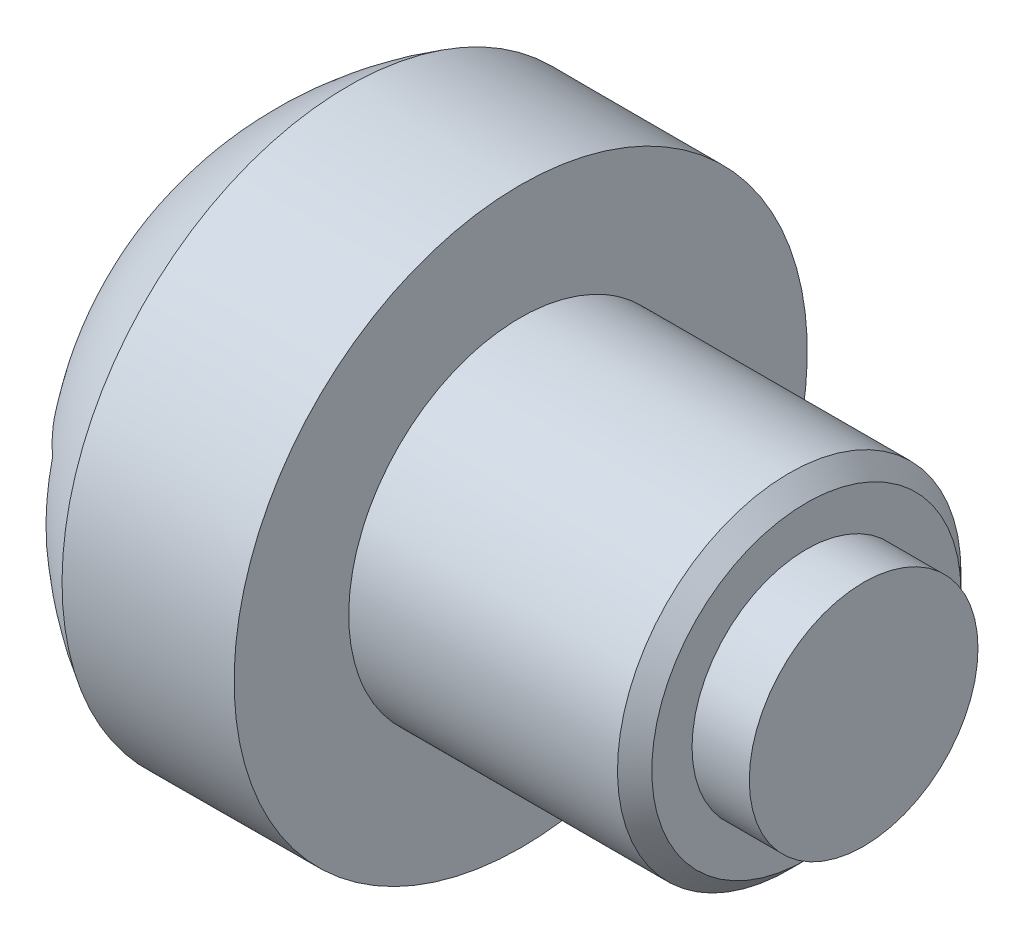
ISO-10303-21;
HEADER;
FILE_DESCRIPTION(('STEP AP214'),'2;1');
FILE_NAME('part.step','',(''),(''),'','','');
FILE_SCHEMA(('AUTOMOTIVE_DESIGN { 1 0 10303 214 1 1 1 1 }'));
ENDSEC;
DATA;
#1=APPLICATION_CONTEXT('core data for automotive mechanical design processes');
#2=APPLICATION_PROTOCOL_DEFINITION('international standard','automotive_design',2000,#1);
#3=PRODUCT_CONTEXT('',#1,'mechanical');
#4=PRODUCT('Part','Part','',(#3));
#5=PRODUCT_RELATED_PRODUCT_CATEGORY('part','',(#4));
#6=PRODUCT_DEFINITION_FORMATION('','',#4);
#7=PRODUCT_DEFINITION_CONTEXT('part definition',#1,'design');
#8=PRODUCT_DEFINITION('design','',#6,#7);
#9=PRODUCT_DEFINITION_SHAPE('','',#8);
#10=(LENGTH_UNIT() NAMED_UNIT(*) SI_UNIT(.MILLI.,.METRE.));
#11=(NAMED_UNIT(*) PLANE_ANGLE_UNIT() SI_UNIT($,.RADIAN.));
#12=(NAMED_UNIT(*) SI_UNIT($,.STERADIAN.) SOLID_ANGLE_UNIT());
#13=UNCERTAINTY_MEASURE_WITH_UNIT(LENGTH_MEASURE(1.E-05),#10,'distance_accuracy_value','');
#14=(GEOMETRIC_REPRESENTATION_CONTEXT(3) GLOBAL_UNCERTAINTY_ASSIGNED_CONTEXT((#13)) GLOBAL_UNIT_ASSIGNED_CONTEXT((#10,
#11,#12)) REPRESENTATION_CONTEXT('',''));
#15=CARTESIAN_POINT('',(0.,0.,0.));
#16=DIRECTION('',(0.,0.,1.));
#17=DIRECTION('',(1.,0.,0.));
#18=AXIS2_PLACEMENT_3D('',#15,#16,#17);
#19=CARTESIAN_POINT('',(1.5,1.21970228257691,0.));
#20=DIRECTION('',(0.999998064473786,0.00196749807655909,0.));
#21=DIRECTION('',(-0.00196749807655909,0.999998064473786,0.));
#22=AXIS2_PLACEMENT_3D('',#19,#20,#21);
#23=CONICAL_SURFACE('',#22,0.,1.56882882744896);
#24=CARTESIAN_POINT('',(1.50984908448812,1.21972166066921,0.));
#25=DIRECTION('',(-0.999998064473786,-0.00196749807655909,0.));
#26=DIRECTION('',(0.00196749807655909,-0.999998064473786,0.));
#27=AXIS2_PLACEMENT_3D('',#24,#25,#26);
#28=CIRCLE('',#27,5.00589281659861);
#29=CARTESIAN_POINT('',(1.51969816897624,-3.78616146689263,0.));
#30=VERTEX_POINT('',#29);
#31=EDGE_CURVE('E72',#30,#30,#28,.T.);
#32=ORIENTED_EDGE('',*,*,#31,.F.);
#33=EDGE_LOOP('',(#32));
#34=FACE_BOUND('',#33,.T.);
#35=CARTESIAN_POINT('',(1.51070560853351,-1.22149756289072,-1.74371537657515));
#36=CARTESIAN_POINT('',(1.51051288772187,-1.12354621654119,-1.88083431070147));
#37=CARTESIAN_POINT('',(1.51029724337528,-1.01394384681967,-2.00978120388583));
#38=CARTESIAN_POINT('',(1.50982623696197,-0.774552307254938,-2.24754843138468));
#39=CARTESIAN_POINT('',(1.5095708273719,-0.644738983346777,-2.35634433815234));
#40=CARTESIAN_POINT('',(1.50902778874365,-0.368736545577182,-2.55055071623116));
#41=CARTESIAN_POINT('',(1.508740175136,-0.222555274409618,-2.63597232032991));
#42=CARTESIAN_POINT('',(1.50814089197871,0.0820339331812517,-2.78103629301132));
#43=CARTESIAN_POINT('',(1.50782922842435,0.240438822445587,-2.84068506205231));
#44=CARTESIAN_POINT('',(1.50719058787602,0.565031854795757,-2.93255146955822));
#45=CARTESIAN_POINT('',(1.50686360925567,0.731220824511049,-2.9647661876679));
#46=CARTESIAN_POINT('',(1.50620363962253,1.06665471168451,-3.00083860188071));
#47=CARTESIAN_POINT('',(1.50587064837413,1.235899748897,-3.00469518432098));
#48=CARTESIAN_POINT('',(1.50520812442166,1.57263210514797,-2.98393947180971));
#49=CARTESIAN_POINT('',(1.50487859165684,1.74011945506436,-2.95932767781977));
#50=CARTESIAN_POINT('',(1.50423233392269,2.06858460590468,-2.88233466185377));
#51=CARTESIAN_POINT('',(1.50391560892761,2.22956241991285,-2.82995349569749));
#52=CARTESIAN_POINT('',(1.50330395633676,2.54043945007239,-2.69890861170875));
#53=CARTESIAN_POINT('',(1.5030090287785,2.69033864715724,-2.62024484864475));
#54=CARTESIAN_POINT('',(1.50244934431282,2.97480265106747,-2.43886797169414));
#55=CARTESIAN_POINT('',(1.50218458735086,3.10936748561306,-2.33615490128295));
#56=CARTESIAN_POINT('',(1.50169275935622,3.3593430373748,-2.10959514771477));
#57=CARTESIAN_POINT('',(1.5014656882879,3.47475377269992,-1.98574848453845));
#58=CARTESIAN_POINT('',(1.50105567743949,3.68314519154401,-1.72043696761519));
#59=CARTESIAN_POINT('',(1.50087273770553,3.77612585160765,-1.57897209544496));
#60=CARTESIAN_POINT('',(1.50055618332727,3.93701730097448,-1.28244037245789));
#61=CARTESIAN_POINT('',(1.50042256857449,4.00492814541095,-1.12737355155523));
#62=CARTESIAN_POINT('',(1.50020845657438,4.11375241511717,-0.808039626132));
#63=CARTESIAN_POINT('',(1.50012795930503,4.15466585157913,-0.64377252542558));
#64=CARTESIAN_POINT('',(1.5000223673498,4.20833388149063,-0.310701301687069));
#65=CARTESIAN_POINT('',(1.49999727258243,4.22108851635309,-0.141897185327901));
#66=CARTESIAN_POINT('',(1.50000319775769,4.21807699432839,0.195456465766539));
#67=CARTESIAN_POINT('',(1.50003421770736,4.20231083386536,0.36400600046989));
#68=CARTESIAN_POINT('',(1.50015149172393,4.14270529533522,0.6960657209704));
#69=CARTESIAN_POINT('',(1.50023774575328,4.09886593635608,0.85957591019391));
#70=CARTESIAN_POINT('',(1.50046303939243,3.98435850483849,1.17691548600875));
#71=CARTESIAN_POINT('',(1.50060207899994,3.913690433469,1.33074487302189));
#72=CARTESIAN_POINT('',(1.50092899698209,3.74753160003536,1.62435619584686));
#73=CARTESIAN_POINT('',(1.50111687538666,3.65204082276173,1.7641381230514));
#74=CARTESIAN_POINT('',(1.50153613763838,3.43894731055318,2.02568645183512));
#75=CARTESIAN_POINT('',(1.50176752148782,3.32134457445342,2.14745285246526));
#76=CARTESIAN_POINT('',(1.50226722677016,3.06736534068733,2.36951374610116));
#77=CARTESIAN_POINT('',(1.50253554826352,2.93098881229138,2.46980820396019));
#78=CARTESIAN_POINT('',(1.50310151169383,2.64333349238762,2.64607791345978));
#79=CARTESIAN_POINT('',(1.50339915362726,2.49205470267195,2.72205316802496));
#80=CARTESIAN_POINT('',(1.50401530939061,2.17888892122861,2.84752791400337));
#81=CARTESIAN_POINT('',(1.50433382325685,2.0170019110462,2.89702735935622));
#82=CARTESIAN_POINT('',(1.50498268092864,1.6872153453928,2.96814517484633));
#83=CARTESIAN_POINT('',(1.50531302473909,1.519315787436,2.98976353345638));
#84=CARTESIAN_POINT('',(1.50597616527842,1.18227006992761,3.00450547702483));
#85=CARTESIAN_POINT('',(1.50630896201137,1.01312390830413,2.99762901461309));
#86=CARTESIAN_POINT('',(1.50696756037291,0.678387001869643,2.95557643126568));
#87=CARTESIAN_POINT('',(1.50729336200885,0.512796253316557,2.9204003401169));
#88=CARTESIAN_POINT('',(1.50792872192243,0.189870645404408,2.82274707902475));
#89=CARTESIAN_POINT('',(1.5082382802027,0.0325357847086201,2.76026991350174));
#90=CARTESIAN_POINT('',(1.5088323664996,-0.269412069090176,2.60978789013597));
#91=CARTESIAN_POINT('',(1.50911689447122,-0.414025039316718,2.52178298639052));
#92=CARTESIAN_POINT('',(1.50965284172317,-0.68642322988811,2.32274401952896));
#93=CARTESIAN_POINT('',(1.50990426109996,-0.814208499258881,2.21171002350836));
#94=CARTESIAN_POINT('',(1.51036685541992,-1.04932453583768,1.9697643586147));
#95=CARTESIAN_POINT('',(1.51057803028254,-1.15665526209994,1.8388526499515));
#96=CARTESIAN_POINT('',(1.51095414346806,-1.34781672064252,1.56086567355324));
#97=CARTESIAN_POINT('',(1.5111190810122,-1.43164705712016,1.41379013363874));
#98=CARTESIAN_POINT('',(1.51139802653702,-1.57342250719973,1.10765815129056));
#99=CARTESIAN_POINT('',(1.51151203651751,-1.63136863721942,0.94860217958965));
#100=CARTESIAN_POINT('',(1.51168589234143,-1.71973170451897,0.62303802199856));
#101=CARTESIAN_POINT('',(1.51174574394714,-1.75015157050991,0.456530630895637));
#102=CARTESIAN_POINT('',(1.5118096074546,-1.7826105046966,0.120726347583));
#103=CARTESIAN_POINT('',(1.51181360547411,-1.78464251718058,-0.0485712276503967));
#104=CARTESIAN_POINT('',(1.51176562219841,-1.76025478719164,-0.385169654853634));
#105=CARTESIAN_POINT('',(1.51171361422722,-1.73382148652975,-0.552469516910072));
#106=CARTESIAN_POINT('',(1.51155507062589,-1.65324093263632,-0.880109484622168));
#107=CARTESIAN_POINT('',(1.51144860066445,-1.59912705585693,-1.0404577203486));
#108=CARTESIAN_POINT('',(1.51123402313099,-1.49006696156909,-1.2916141945144));
#109=CARTESIAN_POINT('',(1.51114151026461,-1.44304683564977,-1.38594581702864));
#110=CARTESIAN_POINT('',(1.51093751829492,-1.33936688781913,-1.56915380237598));
#111=CARTESIAN_POINT('',(1.51082603919164,-1.28270706592571,-1.6580301652192));
#112=CARTESIAN_POINT('',(1.51070560853351,-1.22149756289072,-1.74371537657515));
#113=B_SPLINE_CURVE_WITH_KNOTS('',3,(#35,#36,#37,#38,#39,#40,#41,#42,#43,#44,#45,#46,#47,#48,
#49,#50,#51,#52,#53,#54,#55,#56,#57,#58,#59,#60,#61,#62,#63,#64,#65,#66,#67,#68,#69,#70,#71,#72,
#73,#74,#75,#76,#77,#78,#79,#80,#81,#82,#83,#84,#85,#86,#87,#88,#89,#90,#91,#92,#93,#94,#95,#96,
#97,#98,#99,#100,#101,#102,#103,#104,#105,#106,#107,#108,#109,#110,#111,#112),.UNSPECIFIED.,.T.,
.F.,(4,2,2,2,2,2,2,2,2,2,2,2,2,2,2,2,2,2,2,2,2,2,2,2,2,2,2,2,2,2,2,2,2,2,2,2,2,2,4),(0.,
0.50514996678258,1.01090833795536,1.51642540396819,2.02181685697886,2.52726210219703,
3.03272719683712,3.53818339687968,4.04363858089832,4.54909463479453,5.05454977495376,
5.56000443723482,6.0654596280721,6.57091370731095,7.07636757700558,7.58182070333267,
8.08727389303245,8.59272673905698,9.09817956305809,9.60363269676329,10.1090858570952,
10.6145398447807,11.1199937716807,11.6254485779239,12.1309035931435,12.6363594486382,
13.1418147721137,13.64727001375,14.1527261642759,14.6581808421702,15.1636365318697,
15.6691007341384,16.1745450861567,16.6799356541021,17.1854518330505,17.6912088987438,
18.1963575694087,18.5120242716501,18.827690973306),.UNSPECIFIED.);
#114=CARTESIAN_POINT('',(1.51070560853351,-1.22149756289072,-1.74371537657515));
#115=VERTEX_POINT('',#114);
#116=EDGE_CURVE('E81',#115,#115,#113,.T.);
#117=ORIENTED_EDGE('',*,*,#116,.F.);
#118=EDGE_LOOP('',(#117));
#119=FACE_BOUND('',#118,.T.);
#120=ADVANCED_FACE('F37',(#34,#119),#23,.F.);
#121=CARTESIAN_POINT('',(1.49692192435463,1.21969622645728,0.));
#122=DIRECTION('',(-0.999998064473786,-0.00196749807655909,0.));
#123=DIRECTION('',(0.00196749807655909,-0.999998064473786,0.));
#124=AXIS2_PLACEMENT_3D('',#121,#122,#123);
#125=DEGENERATE_TOROIDAL_SURFACE('',#124,0.191802549126222,6.,.F.);
#126=CARTESIAN_POINT('',(-1.49013930236584,1.21381917786396,0.));
#127=DIRECTION('',(-0.999998064473786,-0.00196749807655909,0.));
#128=DIRECTION('',(0.00196749807655909,-0.999998064473786,0.));
#129=AXIS2_PLACEMENT_3D('',#126,#127,#128);
#130=CIRCLE('',#129,5.01179531082829);
#131=CARTESIAN_POINT('',(-1.48027860473167,-3.79796643250312,0.));
#132=VERTEX_POINT('',#131);
#133=EDGE_CURVE('E157',#132,#132,#130,.T.);
#134=ORIENTED_EDGE('',*,*,#133,.T.);
#135=EDGE_LOOP('',(#134));
#136=FACE_BOUND('',#135,.T.);
#137=CARTESIAN_POINT('',(-2.49,-3.07263613035507,-3.48568929909874E-12));
#138=CARTESIAN_POINT('',(-2.49,-3.0726313174801,0.217540239165427));
#139=CARTESIAN_POINT('',(-2.49,-3.05605552058191,0.435148526636857));
#140=CARTESIAN_POINT('',(-2.49000000000001,-2.99011250617465,0.865466008138611));
#141=CARTESIAN_POINT('',(-2.49000000000001,-2.94071836017108,1.07817103046277));
#142=CARTESIAN_POINT('',(-2.49000000000001,-2.80316709782039,1.51613665454064));
#143=CARTESIAN_POINT('',(-2.49000000000001,-2.71140144874628,1.740274328159));
#144=CARTESIAN_POINT('',(-2.49000000000001,-2.49153669524092,2.16996632814425));
#145=CARTESIAN_POINT('',(-2.49000000000002,-2.36343242782083,2.37551800833746));
#146=CARTESIAN_POINT('',(-2.49000000000002,-2.07453671390858,2.76219221581908));
#147=CARTESIAN_POINT('',(-2.49000000000002,-1.91374701185756,2.94331604597861));
#148=CARTESIAN_POINT('',(-2.49000000000002,-1.56404791083975,3.27599018915623));
#149=CARTESIAN_POINT('',(-2.49000000000002,-1.37513950360981,3.42754154474964));
#150=CARTESIAN_POINT('',(-2.49000000000003,-0.974558078501667,3.69678125546694));
#151=CARTESIAN_POINT('',(-2.49000000000003,-0.762884742950795,3.81446913795953));
#152=CARTESIAN_POINT('',(-2.49000000000003,-0.322782758443666,4.01263833386013));
#153=CARTESIAN_POINT('',(-2.49000000000003,-0.0943539816981594,4.09311936346726));
#154=CARTESIAN_POINT('',(-2.49000000000003,0.372772300347226,4.21458890204758));
#155=CARTESIAN_POINT('',(-2.49000000000003,0.611469774679419,4.25557753011071));
#156=CARTESIAN_POINT('',(-2.49000000000003,1.09235784606178,4.29689906048452));
#157=CARTESIAN_POINT('',(-2.49000000000003,1.33454843848502,4.29723201664217));
#158=CARTESIAN_POINT('',(-2.49000000000003,1.81554815151167,4.25723289050924));
#159=CARTESIAN_POINT('',(-2.49000000000003,2.05435726983425,4.2169007807911));
#160=CARTESIAN_POINT('',(-2.49000000000003,2.5218148065259,4.09671637510744));
#161=CARTESIAN_POINT('',(-2.49000000000003,2.75046322365006,4.01686407429986));
#162=CARTESIAN_POINT('',(-2.49000000000003,3.19110864834893,3.81990606957307));
#163=CARTESIAN_POINT('',(-2.49000000000003,3.4031056575644,3.70280036932465));
#164=CARTESIAN_POINT('',(-2.49000000000002,3.80443032226176,3.43465983955011));
#165=CARTESIAN_POINT('',(-2.49000000000002,3.99375797700714,3.28362500892164));
#166=CARTESIAN_POINT('',(-2.49000000000002,4.34436944893327,2.95191367607934));
#167=CARTESIAN_POINT('',(-2.49000000000002,4.50565326919504,2.77123717712209));
#168=CARTESIAN_POINT('',(-2.49000000000002,4.79559871401524,2.3853713716406));
#169=CARTESIAN_POINT('',(-2.49000000000001,4.92426033938891,2.18018206572896));
#170=CARTESIAN_POINT('',(-2.49000000000001,5.14530905952628,1.75111539555966));
#171=CARTESIAN_POINT('',(-2.49000000000001,5.23769615914718,1.52723803380436));
#172=CARTESIAN_POINT('',(-2.49000000000001,5.3835732480721,1.06715044613717));
#173=CARTESIAN_POINT('',(-2.49000000000001,5.43706323723779,0.830940220181414));
#174=CARTESIAN_POINT('',(-2.49,5.50362767914931,0.35289225313453));
#175=CARTESIAN_POINT('',(-2.49,5.51670213724154,0.111054512787844));
#176=CARTESIAN_POINT('',(-2.49,5.50206438199372,-0.371383455817949));
#177=CARTESIAN_POINT('',(-2.49,5.47435216778721,-0.611983684050767));
#178=CARTESIAN_POINT('',(-2.48999999999999,5.37892774004594,-1.08511668776479));
#179=CARTESIAN_POINT('',(-2.48999999999999,5.31121552687919,-1.31764946332021));
#180=CARTESIAN_POINT('',(-2.48999999999999,5.13771325747437,-1.76804662128436));
#181=CARTESIAN_POINT('',(-2.48999999999999,5.03192320460742,-1.9859110049917));
#182=CARTESIAN_POINT('',(-2.48999999999998,4.78526833414645,-2.40078686784216));
#183=CARTESIAN_POINT('',(-2.48999999999998,4.64440351809436,-2.59779834790199));
#184=CARTESIAN_POINT('',(-2.48999999999998,4.33159780967577,-2.9653758916134));
#185=CARTESIAN_POINT('',(-2.48999999999998,4.15965690853953,-3.135941947802));
#186=CARTESIAN_POINT('',(-2.48999999999998,3.7895798925708,-3.44578676814293));
#187=CARTESIAN_POINT('',(-2.48999999999998,3.59144376851747,-3.58506552128193));
#188=CARTESIAN_POINT('',(-2.48999999999997,3.17460101163133,-3.82838185144292));
#189=CARTESIAN_POINT('',(-2.48999999999997,2.95589439392061,-3.93241945437164));
#190=CARTESIAN_POINT('',(-2.48999999999997,2.5041189873021,-4.10230030417784));
#191=CARTESIAN_POINT('',(-2.48999999999997,2.27105020009401,-4.16814355557543));
#192=CARTESIAN_POINT('',(-2.48999999999997,1.79716625827745,-4.2597666805153));
#193=CARTESIAN_POINT('',(-2.48999999999997,1.55635109391917,-4.28554650363059));
#194=CARTESIAN_POINT('',(-2.48999999999997,1.07381101769169,-4.29631080554452));
#195=CARTESIAN_POINT('',(-2.48999999999997,0.832086106938186,-4.28129533435705));
#196=CARTESIAN_POINT('',(-2.48999999999997,0.354587759109725,-4.21089531502961));
#197=CARTESIAN_POINT('',(-2.48999999999997,0.118814330310099,-4.15551071076096));
#198=CARTESIAN_POINT('',(-2.48999999999997,-0.340090757557964,-4.00594371547908));
#199=CARTESIAN_POINT('',(-2.48999999999997,-0.563222252594855,-3.91176082118158));
#200=CARTESIAN_POINT('',(-2.48999999999997,-0.99050014172498,-3.68727346648033));
#201=CARTESIAN_POINT('',(-2.48999999999998,-1.19464705420843,-3.55696999276679));
#202=CARTESIAN_POINT('',(-2.48999999999998,-1.57815345332415,-3.26395167630599));
#203=CARTESIAN_POINT('',(-2.48999999999998,-1.7575147467034,-3.10123919812535));
#204=CARTESIAN_POINT('',(-2.48999999999998,-2.08640616187643,-2.74797804902795));
#205=CARTESIAN_POINT('',(-2.48999999999998,-2.23593111663872,-2.55742456651053));
#206=CARTESIAN_POINT('',(-2.48999999999999,-2.50090706700524,-2.15386879225476));
#207=CARTESIAN_POINT('',(-2.48999999999999,-2.61634671871255,-1.94085905880787));
#208=CARTESIAN_POINT('',(-2.48999999999999,-2.80973434156893,-1.49859234611991));
#209=CARTESIAN_POINT('',(-2.48999999999999,-2.88771364485276,-1.26934912950689));
#210=CARTESIAN_POINT('',(-2.48999999999999,-2.9879548428052,-0.866133105775337));
#211=CARTESIAN_POINT('',(-2.49,-3.01966805710764,-0.694444995049753));
#212=CARTESIAN_POINT('',(-2.49,-3.06200804160397,-0.34851872387427));
#213=CARTESIAN_POINT('',(-2.49,-3.07263998616411,-0.1742811997537));
#214=CARTESIAN_POINT('',(-2.49,-3.07263613035507,-3.48568929909874E-12));
#215=B_SPLINE_CURVE_WITH_KNOTS('',3,(#137,#138,#139,#140,#141,#142,#143,#144,#145,#146,#147,
#148,#149,#150,#151,#152,#153,#154,#155,#156,#157,#158,#159,#160,#161,#162,#163,#164,#165,#166,
#167,#168,#169,#170,#171,#172,#173,#174,#175,#176,#177,#178,#179,#180,#181,#182,#183,#184,#185,
#186,#187,#188,#189,#190,#191,#192,#193,#194,#195,#196,#197,#198,#199,#200,#201,#202,#203,#204,
#205,#206,#207,#208,#209,#210,#211,#212,#213,#214),.UNSPECIFIED.,.T.,.F.,(4,2,2,2,2,2,2,2,2,2,2,
2,2,2,2,2,2,2,2,2,2,2,2,2,2,2,2,2,2,2,2,2,2,2,2,2,2,2,4),(0.,0.652103302843681,1.30474233897939,
2.027826095934,2.75101264008962,3.47416059747693,4.19728305573082,4.92041560608995,
5.64355367216041,6.36668955758997,7.08982448525231,7.8129599006511,8.53609540464915,
9.25923083739255,9.98236629363012,10.7055016704205,11.4286370291393,12.1517722910297,
12.8749075554919,13.5980427242935,14.3211779084576,15.0443130859688,15.7674481994592,
16.4905832811597,17.2137185669306,17.9368541072493,18.6599891159698,19.3831240391108,
20.1062598724456,20.8293948192362,21.5525307714655,22.2756761043765,22.998801685386,
23.7218745263403,24.4450724799573,25.1685108497981,25.8913430719047,26.4139004239722,
26.9363294992313),.UNSPECIFIED.);
#216=CARTESIAN_POINT('',(-2.49000000000003,0.207897271268649,4.17111174548835));
#217=VERTEX_POINT('',#216);
#218=CARTESIAN_POINT('',(-2.49000000000003,2.20789727126865,4.1766046970152));
#219=VERTEX_POINT('',#218);
#220=EDGE_CURVE('E58',#217,#219,#215,.T.);
#221=ORIENTED_EDGE('',*,*,#220,.F.);
#222=CARTESIAN_POINT('',(-2.4887010296532,0.207897271268649,-4.17229984004044));
#223=CARTESIAN_POINT('',(-2.61072092483367,0.207897271268649,-4.06075121654269));
#224=CARTESIAN_POINT('',(-2.72802813287401,0.207897271268649,-3.94405115785741));
#225=CARTESIAN_POINT('',(-2.95243849660971,0.207897271268649,-3.70121283306284));
#226=CARTESIAN_POINT('',(-3.05954128015559,0.207897271268649,-3.57507422303431));
#227=CARTESIAN_POINT('',(-3.26320193271114,0.207897271268649,-3.31365817776596));
#228=CARTESIAN_POINT('',(-3.35971135814925,0.207897271268649,-3.17834299300375));
#229=CARTESIAN_POINT('',(-3.54093027994202,0.207897271268649,-2.90003805348027));
#230=CARTESIAN_POINT('',(-3.62564034801828,0.207897271268649,-2.75704867102707));
#231=CARTESIAN_POINT('',(-3.78250367437377,0.207897271268649,-2.46461491266613));
#232=CARTESIAN_POINT('',(-3.85467554579644,0.207897271268649,-2.31518052336489));
#233=CARTESIAN_POINT('',(-3.98603585250852,0.207897271268649,-2.01069288656355));
#234=CARTESIAN_POINT('',(-4.04522323005551,0.207897271268649,-1.85563918250096));
#235=CARTESIAN_POINT('',(-4.14992042976133,0.207897271268649,-1.5413429478506));
#236=CARTESIAN_POINT('',(-4.1954593123771,0.207897271268649,-1.38211011368515));
#237=CARTESIAN_POINT('',(-4.27238541801165,0.207897271268649,-1.06026211038084));
#238=CARTESIAN_POINT('',(-4.30377331891611,0.207897271268649,-0.897647103651339));
#239=CARTESIAN_POINT('',(-4.35083542280622,0.207897271268649,-0.574075314521675));
#240=CARTESIAN_POINT('',(-4.36686770106949,0.207897271268649,-0.413171980349019));
#241=CARTESIAN_POINT('',(-4.37917739126408,0.207897271268649,-0.17127361093524));
#242=CARTESIAN_POINT('',(-4.38132407646711,0.207897271268649,-0.0905482947303475));
#243=CARTESIAN_POINT('',(-4.3816455804838,0.207897271268649,0.070910268591079));
#244=CARTESIAN_POINT('',(-4.37982040075791,0.207897271268649,0.151643515704686));
#245=CARTESIAN_POINT('',(-4.36845961641584,0.207897271268649,0.393593664362022));
#246=CARTESIAN_POINT('',(-4.35303889685015,0.207897271268649,0.554563570393473));
#247=CARTESIAN_POINT('',(-4.30771202174849,0.207897271268649,0.874441977983611));
#248=CARTESIAN_POINT('',(-4.2778016876288,0.207897271268649,1.03334987130735));
#249=CARTESIAN_POINT('',(-4.20814744513706,0.207897271268649,1.33212789280238));
#250=CARTESIAN_POINT('',(-4.16969893018287,0.207897271268649,1.47230220791532));
#251=CARTESIAN_POINT('',(-4.08231624487199,0.207897271268649,1.74930457252951));
#252=CARTESIAN_POINT('',(-4.03338461221133,0.207897271268649,1.88613342296736));
#253=CARTESIAN_POINT('',(-3.92540903121722,0.207897271268649,2.15578122201798));
#254=CARTESIAN_POINT('',(-3.86636235015118,0.207897271268649,2.28859907556332));
#255=CARTESIAN_POINT('',(-3.73855159130321,0.207897271268649,2.54947449554097));
#256=CARTESIAN_POINT('',(-3.66978738621612,0.207897271268649,2.67753199958219));
#257=CARTESIAN_POINT('',(-3.52185777845289,0.207897271268649,2.93006557465335));
#258=CARTESIAN_POINT('',(-3.44255256100487,0.207897271268649,3.05445976078877));
#259=CARTESIAN_POINT('',(-3.27482570132715,0.207897271268649,3.29694092298788));
#260=CARTESIAN_POINT('',(-3.18640407740249,0.207897271268649,3.41502791171522));
#261=CARTESIAN_POINT('',(-3.00106443185407,0.207897271268649,3.6440966868889));
#262=CARTESIAN_POINT('',(-2.9041568493069,0.207897271268649,3.75508692042333));
#263=CARTESIAN_POINT('',(-2.70231138909706,0.207897271268649,3.96951243309841));
#264=CARTESIAN_POINT('',(-2.59737333803628,0.207897271268649,4.07294754901065));
#265=CARTESIAN_POINT('',(-2.4887010296532,0.207897271268649,4.17229984004044));
#266=B_SPLINE_CURVE_WITH_KNOTS('',3,(#222,#223,#224,#225,#226,#227,#228,#229,#230,#231,#232,
#233,#234,#235,#236,#237,#238,#239,#240,#241,#242,#243,#244,#245,#246,#247,#248,#249,#250,#251,
#252,#253,#254,#255,#256,#257,#258,#259,#260,#261,#262,#263,#264,#265),.UNSPECIFIED.,.F.,.F.,(4,
2,2,2,2,2,2,2,2,2,2,2,2,2,2,2,2,2,2,2,2,4),(0.,0.495822108572,0.991662292574569,
1.48968298366811,1.9876795354557,2.48493036640434,2.98222168935504,3.47844652901382,
3.97464759509485,4.45897385012996,4.70114872857645,4.94332351797514,5.42766532982458,
5.91214690168646,6.34778476036526,6.78331728112201,7.21896765365164,7.654623733981,
8.09677647714443,8.53892833251635,8.98054371326308,9.42216863229498),.UNSPECIFIED.);
#267=CARTESIAN_POINT('',(-2.48999999999997,0.207897271268649,-4.17111174548842));
#268=VERTEX_POINT('',#267);
#269=EDGE_CURVE('E76',#268,#217,#266,.T.);
#270=ORIENTED_EDGE('',*,*,#269,.F.);
#271=CARTESIAN_POINT('',(-2.48999999999997,2.20789727126865,-4.17660469701525));
#272=VERTEX_POINT('',#271);
#273=EDGE_CURVE('E64',#272,#268,#215,.T.);
#274=ORIENTED_EDGE('',*,*,#273,.F.);
#275=CARTESIAN_POINT('',(-2.48476603350008,2.20789727126865,4.18138166297272));
#276=CARTESIAN_POINT('',(-2.60704522165866,2.20789727126865,4.06993627510243));
#277=CARTESIAN_POINT('',(-2.72461591146361,2.20789727126865,3.95332832658345));
#278=CARTESIAN_POINT('',(-2.94955956990277,2.20789727126865,3.71065176974713));
#279=CARTESIAN_POINT('',(-3.05693218512319,2.20789727126865,3.58458283383055));
#280=CARTESIAN_POINT('',(-3.26113337315032,2.20789727126865,3.3232897691709));
#281=CARTESIAN_POINT('',(-3.35791406902746,2.20789727126865,3.18802821591259));
#282=CARTESIAN_POINT('',(-3.53967980145966,2.20789727126865,2.9098075875715));
#283=CARTESIAN_POINT('',(-3.6246653948647,2.20789727126865,2.76684887631618));
#284=CARTESIAN_POINT('',(-3.78208319428837,2.20789727126865,2.4744512731801));
#285=CARTESIAN_POINT('',(-3.85453382368784,2.20789727126865,2.32502230223128));
#286=CARTESIAN_POINT('',(-3.98645269086001,2.20789727126865,2.02052295786889));
#287=CARTESIAN_POINT('',(-4.04591991197728,2.20789727126865,1.86545214378367));
#288=CARTESIAN_POINT('',(-4.15117917826992,2.20789727126865,1.55109474885461));
#289=CARTESIAN_POINT('',(-4.19699991874443,2.20789727126865,1.39181779192987));
#290=CARTESIAN_POINT('',(-4.27449353248181,2.20789727126865,1.06985779982565));
#291=CARTESIAN_POINT('',(-4.3061669817701,2.20789727126865,0.907174903605849));
#292=CARTESIAN_POINT('',(-4.3538164738352,2.20789727126865,0.583375610164878));
#293=CARTESIAN_POINT('',(-4.37014399318176,2.20789727126865,0.422312275731059));
#294=CARTESIAN_POINT('',(-4.38289232072367,2.20789727126865,0.180153411194699));
#295=CARTESIAN_POINT('',(-4.38518452937034,2.20789727126865,0.099338106940214));
#296=CARTESIAN_POINT('',(-4.38579103707715,2.20789727126865,-0.0623074092413212));
#297=CARTESIAN_POINT('',(-4.38410534233238,2.20789727126865,-0.143137621144959));
#298=CARTESIAN_POINT('',(-4.37314738928263,2.20789727126865,-0.385384416904564));
#299=CARTESIAN_POINT('',(-4.35797459850991,2.20789727126865,-0.546563629351585));
#300=CARTESIAN_POINT('',(-4.31310076846164,2.20789727126865,-0.866878199676324));
#301=CARTESIAN_POINT('',(-4.28339548757192,2.20789727126865,-1.02601294690864));
#302=CARTESIAN_POINT('',(-4.21411756705993,2.20789727126865,-1.3251569591824));
#303=CARTESIAN_POINT('',(-4.17584941482649,2.20789727126865,-1.46547056357024));
#304=CARTESIAN_POINT('',(-4.08881483715743,2.20789727126865,-1.74276385419197));
#305=CARTESIAN_POINT('',(-4.04005097288575,2.20789727126865,-1.87974434471199));
#306=CARTESIAN_POINT('',(-3.93239698122858,2.20789727126865,-2.14971220074516));
#307=CARTESIAN_POINT('',(-3.87350376625451,2.20789727126865,-2.28269833415308));
#308=CARTESIAN_POINT('',(-3.74598691416956,2.20789727126865,-2.54392137627028));
#309=CARTESIAN_POINT('',(-3.6773631194507,2.20789727126865,-2.6721582080118));
#310=CARTESIAN_POINT('',(-3.52896725558263,2.20789727126865,-2.92632280295826));
#311=CARTESIAN_POINT('',(-3.44895983171793,2.20789727126865,-3.05211321309763));
#312=CARTESIAN_POINT('',(-3.27963695778539,2.20789727126865,-3.29726486249109));
#313=CARTESIAN_POINT('',(-3.19032145143603,2.20789727126865,-3.41662606286422));
#314=CARTESIAN_POINT('',(-3.00301854418144,2.20789727126865,-3.64809966975827));
#315=CARTESIAN_POINT('',(-2.90504173090292,2.20789727126865,-3.76022064426565));
#316=CARTESIAN_POINT('',(-2.70090023951681,2.20789727126865,-3.97674585969877));
#317=CARTESIAN_POINT('',(-2.59473544102626,2.20789727126865,-4.08114998712417));
#318=CARTESIAN_POINT('',(-2.48476603350008,2.20789727126865,-4.18138166297272));
#319=B_SPLINE_CURVE_WITH_KNOTS('',3,(#275,#276,#277,#278,#279,#280,#281,#282,#283,#284,#285,
#286,#287,#288,#289,#290,#291,#292,#293,#294,#295,#296,#297,#298,#299,#300,#301,#302,#303,#304,
#305,#306,#307,#308,#309,#310,#311,#312,#313,#314,#315,#316,#317,#318),.UNSPECIFIED.,.F.,.F.,(4,
2,2,2,2,2,2,2,2,2,2,2,2,2,2,2,2,2,2,2,2,4),(0.,0.496187710967812,0.99239261102785,
1.49075507668726,1.98909400651083,2.48669415835464,2.9843332604184,3.48091843545547,
3.97748338953604,4.46237630002456,4.7048329539241,4.94728923022778,5.43218243677518,
5.91721725415674,6.35311506561839,6.78890662963282,7.22483126608927,7.66076296410421,
8.10756685501621,8.55437344769435,9.00064122087225,9.44691555650522),.UNSPECIFIED.);
#320=EDGE_CURVE('E71',#219,#272,#319,.T.);
#321=ORIENTED_EDGE('',*,*,#320,.F.);
#322=EDGE_LOOP('',(#221,#270,#274,#321));
#323=FACE_BOUND('',#322,.T.);
#324=ADVANCED_FACE('F79',(#136,#323),#125,.F.);
#325=CARTESIAN_POINT('',(-1.49013930236584,1.21381917786396,0.));
#326=DIRECTION('',(-0.999998064473786,-0.00196749807655909,0.));
#327=DIRECTION('',(0.00196749807655909,-0.999998064473786,0.));
#328=AXIS2_PLACEMENT_3D('',#325,#326,#327);
#329=CONICAL_SURFACE('',#328,5.01179531082829,0.00196749934594122);
#330=ORIENTED_EDGE('',*,*,#31,.T.);
#331=EDGE_LOOP('',(#330));
#332=FACE_BOUND('',#331,.T.);
#333=ORIENTED_EDGE('',*,*,#133,.F.);
#334=EDGE_LOOP('',(#333));
#335=FACE_BOUND('',#334,.T.);
#336=ADVANCED_FACE('F104',(#332,#335),#329,.T.);
#337=CARTESIAN_POINT('',(-6.29999999999997,0.207897271268649,-5.01179531082832));
#338=DIRECTION('',(0.,1.,0.));
#339=DIRECTION('',(0.,0.,1.));
#340=AXIS2_PLACEMENT_3D('',#337,#338,#339);
#341=PLANE('',#340);
#342=ORIENTED_EDGE('',*,*,#269,.T.);
#343=DIRECTION('',(0.,0.,1.));
#344=VECTOR('',#343,1.);
#345=CARTESIAN_POINT('',(-2.48999999999997,0.207897271268649,-5.01179531082829));
#346=LINE('',#345,#344);
#347=EDGE_CURVE('E67',#268,#217,#346,.T.);
#348=ORIENTED_EDGE('',*,*,#347,.F.);
#349=EDGE_LOOP('',(#342,#348));
#350=FACE_BOUND('',#349,.T.);
#351=ADVANCED_FACE('F75',(#350),#341,.T.);
#352=CARTESIAN_POINT('',(-6.29999999999997,2.20789727126865,-5.01179531082832));
#353=DIRECTION('',(0.,-1.,0.));
#354=DIRECTION('',(0.,0.,-1.));
#355=AXIS2_PLACEMENT_3D('',#352,#353,#354);
#356=PLANE('',#355);
#357=ORIENTED_EDGE('',*,*,#320,.T.);
#358=DIRECTION('',(0.,0.,-1.));
#359=VECTOR('',#358,1.);
#360=CARTESIAN_POINT('',(-2.48999999999997,2.20789727126865,-5.01179531082829));
#361=LINE('',#360,#359);
#362=EDGE_CURVE('E53',#219,#272,#361,.T.);
#363=ORIENTED_EDGE('',*,*,#362,.F.);
#364=EDGE_LOOP('',(#357,#363));
#365=FACE_BOUND('',#364,.T.);
#366=ADVANCED_FACE('F103',(#365),#356,.T.);
#367=CARTESIAN_POINT('',(-2.49,0.,0.));
#368=DIRECTION('',(-1.,0.,0.));
#369=DIRECTION('',(0.,0.,1.));
#370=AXIS2_PLACEMENT_3D('',#367,#368,#369);
#371=PLANE('',#370);
#372=ORIENTED_EDGE('',*,*,#220,.T.);
#373=ORIENTED_EDGE('',*,*,#362,.T.);
#374=ORIENTED_EDGE('',*,*,#273,.T.);
#375=ORIENTED_EDGE('',*,*,#347,.T.);
#376=EDGE_LOOP('',(#372,#373,#374,#375));
#377=FACE_BOUND('',#376,.T.);
#378=ADVANCED_FACE('F66',(#377),#371,.T.);
#379=CARTESIAN_POINT('',(6.5,1.21970228257691,0.));
#380=DIRECTION('',(-1.,0.,0.));
#381=DIRECTION('',(0.,0.,1.));
#382=AXIS2_PLACEMENT_3D('',#379,#380,#381);
#383=CYLINDRICAL_SURFACE('',#382,3.);
#384=CARTESIAN_POINT('',(6.2,1.21970228257691,0.));
#385=DIRECTION('',(1.,0.,0.));
#386=DIRECTION('',(0.,0.,-1.));
#387=AXIS2_PLACEMENT_3D('',#384,#385,#386);
#388=CIRCLE('',#387,3.);
#389=CARTESIAN_POINT('',(6.2,1.21970228257691,-3.));
#390=VERTEX_POINT('',#389);
#391=EDGE_CURVE('E41',#390,#390,#388,.F.);
#392=ORIENTED_EDGE('',*,*,#391,.T.);
#393=EDGE_LOOP('',(#392));
#394=FACE_BOUND('',#393,.T.);
#395=ORIENTED_EDGE('',*,*,#116,.T.);
#396=EDGE_LOOP('',(#395));
#397=FACE_BOUND('',#396,.T.);
#398=ADVANCED_FACE('F129',(#394,#397),#383,.T.);
#399=CARTESIAN_POINT('',(6.5,1.21970228257691,0.));
#400=DIRECTION('',(1.,0.,0.));
#401=DIRECTION('',(0.,0.,-1.));
#402=AXIS2_PLACEMENT_3D('',#399,#400,#401);
#403=PLANE('',#402);
#404=CARTESIAN_POINT('',(6.5,1.21970228257691,0.));
#405=DIRECTION('',(1.,0.,0.));
#406=DIRECTION('',(0.,0.,-1.));
#407=AXIS2_PLACEMENT_3D('',#404,#405,#406);
#408=CIRCLE('',#407,1.99745485214237);
#409=CARTESIAN_POINT('',(6.5,1.21970228257691,-1.99745485214237));
#410=VERTEX_POINT('',#409);
#411=EDGE_CURVE('E11',#410,#410,#408,.T.);
#412=ORIENTED_EDGE('',*,*,#411,.F.);
#413=EDGE_LOOP('',(#412));
#414=FACE_BOUND('',#413,.T.);
#415=CARTESIAN_POINT('',(6.5,1.21970228257691,0.));
#416=DIRECTION('',(1.,0.,0.));
#417=DIRECTION('',(0.,0.,-1.));
#418=AXIS2_PLACEMENT_3D('',#415,#416,#417);
#419=CIRCLE('',#418,2.7);
#420=CARTESIAN_POINT('',(6.5,1.21970228257691,-2.7));
#421=VERTEX_POINT('',#420);
#422=EDGE_CURVE('E122',#421,#421,#419,.T.);
#423=ORIENTED_EDGE('',*,*,#422,.T.);
#424=EDGE_LOOP('',(#423));
#425=FACE_BOUND('',#424,.T.);
#426=ADVANCED_FACE('F134',(#414,#425),#403,.T.);
#427=CARTESIAN_POINT('',(6.5,1.21970228257691,0.));
#428=DIRECTION('',(-1.,0.,0.));
#429=DIRECTION('',(0.,0.,1.));
#430=AXIS2_PLACEMENT_3D('',#427,#428,#429);
#431=CONICAL_SURFACE('',#430,2.7,0.785398163397448);
#432=ORIENTED_EDGE('',*,*,#391,.F.);
#433=EDGE_LOOP('',(#432));
#434=FACE_BOUND('',#433,.T.);
#435=ORIENTED_EDGE('',*,*,#422,.F.);
#436=EDGE_LOOP('',(#435));
#437=FACE_BOUND('',#436,.T.);
#438=ADVANCED_FACE('F39',(#434,#437),#431,.T.);
#439=CARTESIAN_POINT('',(7.5,1.21970228257691,0.));
#440=DIRECTION('',(-1.,0.,0.));
#441=DIRECTION('',(0.,0.,1.));
#442=AXIS2_PLACEMENT_3D('',#439,#440,#441);
#443=CYLINDRICAL_SURFACE('',#442,1.99745485214237);
#444=CARTESIAN_POINT('',(7.5,1.21970228257691,0.));
#445=DIRECTION('',(1.,0.,0.));
#446=DIRECTION('',(0.,0.,-1.));
#447=AXIS2_PLACEMENT_3D('',#444,#445,#446);
#448=CIRCLE('',#447,1.99745485214237);
#449=CARTESIAN_POINT('',(7.5,1.21970228257691,-1.99745485214237));
#450=VERTEX_POINT('',#449);
#451=EDGE_CURVE('E77',#450,#450,#448,.T.);
#452=ORIENTED_EDGE('',*,*,#451,.F.);
#453=EDGE_LOOP('',(#452));
#454=FACE_BOUND('',#453,.T.);
#455=ORIENTED_EDGE('',*,*,#411,.T.);
#456=EDGE_LOOP('',(#455));
#457=FACE_BOUND('',#456,.T.);
#458=ADVANCED_FACE('F133',(#454,#457),#443,.T.);
#459=CARTESIAN_POINT('',(7.5,1.21970228257691,0.));
#460=DIRECTION('',(1.,0.,0.));
#461=DIRECTION('',(0.,0.,-1.));
#462=AXIS2_PLACEMENT_3D('',#459,#460,#461);
#463=PLANE('',#462);
#464=ORIENTED_EDGE('',*,*,#451,.T.);
#465=EDGE_LOOP('',(#464));
#466=FACE_BOUND('',#465,.T.);
#467=ADVANCED_FACE('F139',(#466),#463,.T.);
#468=CLOSED_SHELL('',(#120,#324,#336,#351,#366,#378,#398,#426,#438,#458,#467));
#469=MANIFOLD_SOLID_BREP('B2',#468);
#470=ADVANCED_BREP_SHAPE_REPRESENTATION('',(#18,#469),#14);
#471=SHAPE_DEFINITION_REPRESENTATION(#9,#470);
ENDSEC;
END-ISO-10303-21;
